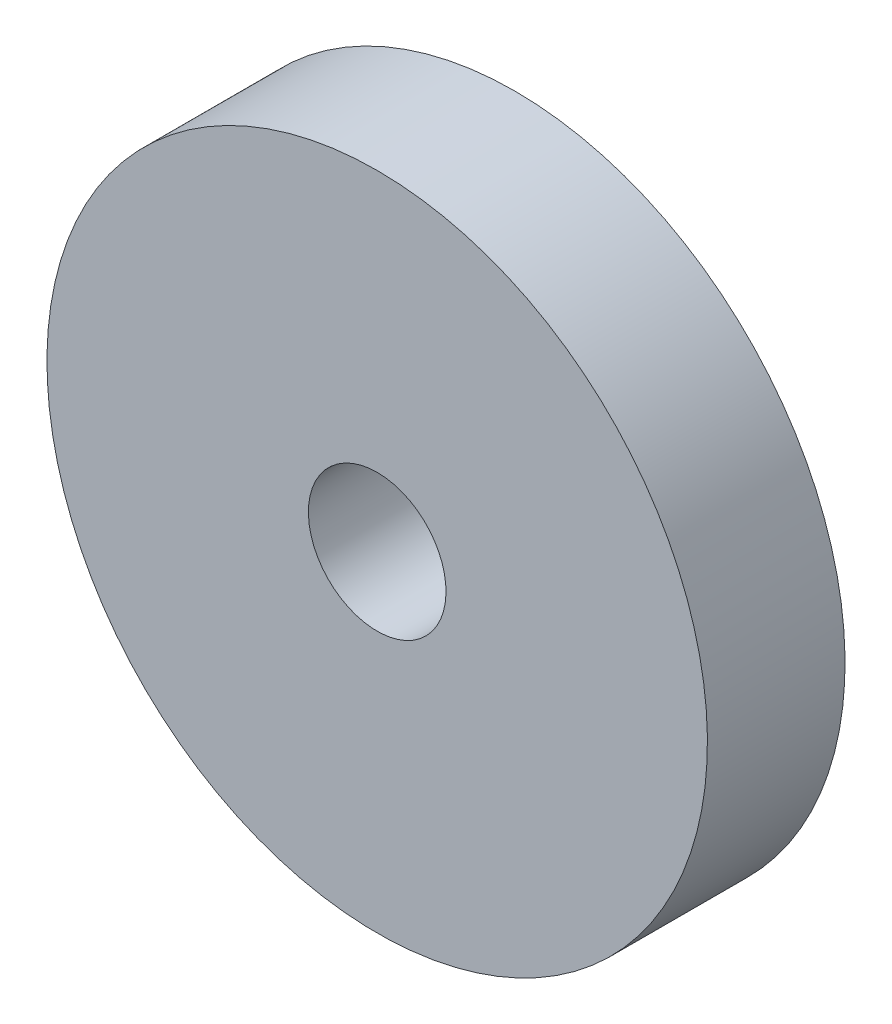
ISO-10303-21;
HEADER;
FILE_DESCRIPTION(('STEP AP214'),'2;1');
FILE_NAME('part.step','',(''),(''),'','','');
FILE_SCHEMA(('AUTOMOTIVE_DESIGN { 1 0 10303 214 1 1 1 1 }'));
ENDSEC;
DATA;
#1=APPLICATION_CONTEXT('core data for automotive mechanical design processes');
#2=APPLICATION_PROTOCOL_DEFINITION('international standard','automotive_design',2000,#1);
#3=PRODUCT_CONTEXT('',#1,'mechanical');
#4=PRODUCT('Part','Part','',(#3));
#5=PRODUCT_RELATED_PRODUCT_CATEGORY('part','',(#4));
#6=PRODUCT_DEFINITION_FORMATION('','',#4);
#7=PRODUCT_DEFINITION_CONTEXT('part definition',#1,'design');
#8=PRODUCT_DEFINITION('design','',#6,#7);
#9=PRODUCT_DEFINITION_SHAPE('','',#8);
#10=(LENGTH_UNIT() NAMED_UNIT(*) SI_UNIT(.MILLI.,.METRE.));
#11=(NAMED_UNIT(*) PLANE_ANGLE_UNIT() SI_UNIT($,.RADIAN.));
#12=(NAMED_UNIT(*) SI_UNIT($,.STERADIAN.) SOLID_ANGLE_UNIT());
#13=UNCERTAINTY_MEASURE_WITH_UNIT(LENGTH_MEASURE(1.E-05),#10,'distance_accuracy_value','');
#14=(GEOMETRIC_REPRESENTATION_CONTEXT(3) GLOBAL_UNCERTAINTY_ASSIGNED_CONTEXT((#13)) GLOBAL_UNIT_ASSIGNED_CONTEXT((#10,
#11,#12)) REPRESENTATION_CONTEXT('',''));
#15=CARTESIAN_POINT('',(0.,0.,0.));
#16=DIRECTION('',(0.,0.,1.));
#17=DIRECTION('',(1.,0.,0.));
#18=AXIS2_PLACEMENT_3D('',#15,#16,#17);
#19=CARTESIAN_POINT('',(-1.,0.,11.25));
#20=DIRECTION('',(0.,0.,-1.));
#21=DIRECTION('',(0.,1.,0.));
#22=AXIS2_PLACEMENT_3D('',#19,#20,#21);
#23=CYLINDRICAL_SURFACE('',#22,2.5);
#24=CARTESIAN_POINT('',(-1.,0.,6.25));
#25=DIRECTION('',(0.,0.,-1.));
#26=DIRECTION('',(0.,1.,0.));
#27=AXIS2_PLACEMENT_3D('',#24,#25,#26);
#28=CIRCLE('',#27,2.5);
#29=CARTESIAN_POINT('',(-1.,2.5,6.25));
#30=VERTEX_POINT('',#29);
#31=EDGE_CURVE('E10',#30,#30,#28,.T.);
#32=ORIENTED_EDGE('',*,*,#31,.T.);
#33=EDGE_LOOP('',(#32));
#34=FACE_BOUND('',#33,.T.);
#35=CARTESIAN_POINT('',(-1.,0.,11.25));
#36=DIRECTION('',(0.,0.,-1.));
#37=DIRECTION('',(0.,1.,0.));
#38=AXIS2_PLACEMENT_3D('',#35,#36,#37);
#39=CIRCLE('',#38,2.5);
#40=CARTESIAN_POINT('',(-1.,2.5,11.25));
#41=VERTEX_POINT('',#40);
#42=EDGE_CURVE('E46',#41,#41,#39,.T.);
#43=ORIENTED_EDGE('',*,*,#42,.F.);
#44=EDGE_LOOP('',(#43));
#45=FACE_BOUND('',#44,.T.);
#46=ADVANCED_FACE('F32',(#34,#45),#23,.F.);
#47=CARTESIAN_POINT('',(1.5,0.,6.25));
#48=DIRECTION('',(0.,0.,-1.));
#49=DIRECTION('',(0.,1.,0.));
#50=AXIS2_PLACEMENT_3D('',#47,#48,#49);
#51=PLANE('',#50);
#52=CARTESIAN_POINT('',(-1.,0.,6.25));
#53=DIRECTION('',(0.,0.,-1.));
#54=DIRECTION('',(0.,1.,0.));
#55=AXIS2_PLACEMENT_3D('',#52,#53,#54);
#56=CIRCLE('',#55,12.);
#57=CARTESIAN_POINT('',(-1.,12.,6.25));
#58=VERTEX_POINT('',#57);
#59=EDGE_CURVE('E38',#58,#58,#56,.T.);
#60=ORIENTED_EDGE('',*,*,#59,.T.);
#61=EDGE_LOOP('',(#60));
#62=FACE_BOUND('',#61,.T.);
#63=ORIENTED_EDGE('',*,*,#31,.F.);
#64=EDGE_LOOP('',(#63));
#65=FACE_BOUND('',#64,.T.);
#66=ADVANCED_FACE('F56',(#62,#65),#51,.T.);
#67=CARTESIAN_POINT('',(-1.,0.,11.25));
#68=DIRECTION('',(0.,0.,-1.));
#69=DIRECTION('',(0.,1.,0.));
#70=AXIS2_PLACEMENT_3D('',#67,#68,#69);
#71=CYLINDRICAL_SURFACE('',#70,12.);
#72=CARTESIAN_POINT('',(-1.,0.,11.25));
#73=DIRECTION('',(0.,0.,-1.));
#74=DIRECTION('',(0.,1.,0.));
#75=AXIS2_PLACEMENT_3D('',#72,#73,#74);
#76=CIRCLE('',#75,12.);
#77=CARTESIAN_POINT('',(-1.,12.,11.25));
#78=VERTEX_POINT('',#77);
#79=EDGE_CURVE('E42',#78,#78,#76,.T.);
#80=ORIENTED_EDGE('',*,*,#79,.T.);
#81=EDGE_LOOP('',(#80));
#82=FACE_BOUND('',#81,.T.);
#83=ORIENTED_EDGE('',*,*,#59,.F.);
#84=EDGE_LOOP('',(#83));
#85=FACE_BOUND('',#84,.T.);
#86=ADVANCED_FACE('F60',(#82,#85),#71,.T.);
#87=CARTESIAN_POINT('',(11.,0.,11.25));
#88=DIRECTION('',(0.,0.,1.));
#89=DIRECTION('',(0.,-1.,0.));
#90=AXIS2_PLACEMENT_3D('',#87,#88,#89);
#91=PLANE('',#90);
#92=ORIENTED_EDGE('',*,*,#42,.T.);
#93=EDGE_LOOP('',(#92));
#94=FACE_BOUND('',#93,.T.);
#95=ORIENTED_EDGE('',*,*,#79,.F.);
#96=EDGE_LOOP('',(#95));
#97=FACE_BOUND('',#96,.T.);
#98=ADVANCED_FACE('F52',(#94,#97),#91,.T.);
#99=CLOSED_SHELL('',(#46,#66,#86,#98));
#100=MANIFOLD_SOLID_BREP('B2',#99);
#101=ADVANCED_BREP_SHAPE_REPRESENTATION('',(#18,#100),#14);
#102=SHAPE_DEFINITION_REPRESENTATION(#9,#101);
ENDSEC;
END-ISO-10303-21;
